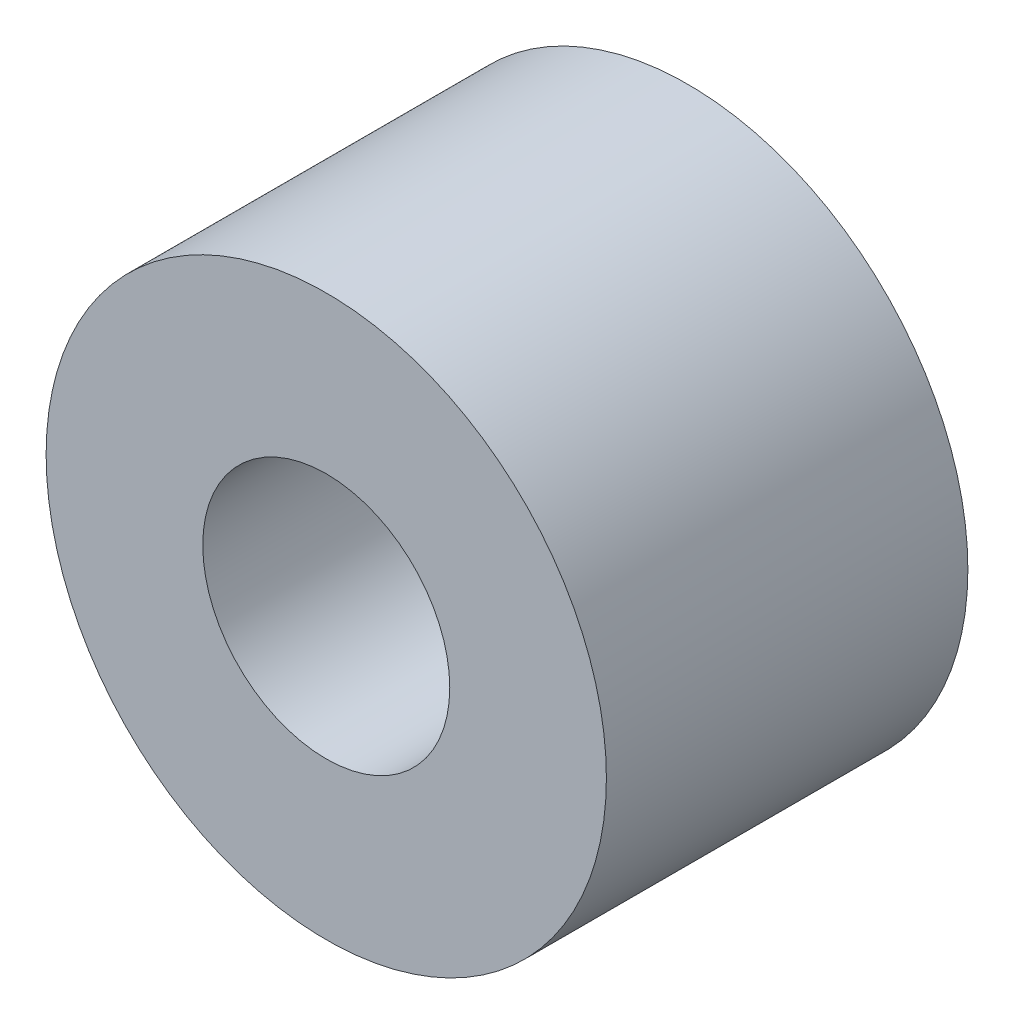
ISO-10303-21;
HEADER;
FILE_DESCRIPTION(('STEP AP214'),'2;1');
FILE_NAME('part.step','',(''),(''),'','','');
FILE_SCHEMA(('AUTOMOTIVE_DESIGN { 1 0 10303 214 1 1 1 1 }'));
ENDSEC;
DATA;
#1=APPLICATION_CONTEXT('core data for automotive mechanical design processes');
#2=APPLICATION_PROTOCOL_DEFINITION('international standard','automotive_design',2000,#1);
#3=PRODUCT_CONTEXT('',#1,'mechanical');
#4=PRODUCT('Part','Part','',(#3));
#5=PRODUCT_RELATED_PRODUCT_CATEGORY('part','',(#4));
#6=PRODUCT_DEFINITION_FORMATION('','',#4);
#7=PRODUCT_DEFINITION_CONTEXT('part definition',#1,'design');
#8=PRODUCT_DEFINITION('design','',#6,#7);
#9=PRODUCT_DEFINITION_SHAPE('','',#8);
#10=(LENGTH_UNIT() NAMED_UNIT(*) SI_UNIT(.MILLI.,.METRE.));
#11=(NAMED_UNIT(*) PLANE_ANGLE_UNIT() SI_UNIT($,.RADIAN.));
#12=(NAMED_UNIT(*) SI_UNIT($,.STERADIAN.) SOLID_ANGLE_UNIT());
#13=UNCERTAINTY_MEASURE_WITH_UNIT(LENGTH_MEASURE(1.E-05),#10,'distance_accuracy_value','');
#14=(GEOMETRIC_REPRESENTATION_CONTEXT(3) GLOBAL_UNCERTAINTY_ASSIGNED_CONTEXT((#13)) GLOBAL_UNIT_ASSIGNED_CONTEXT((#10,
#11,#12)) REPRESENTATION_CONTEXT('',''));
#15=CARTESIAN_POINT('',(0.,0.,0.));
#16=DIRECTION('',(0.,0.,1.));
#17=DIRECTION('',(1.,0.,0.));
#18=AXIS2_PLACEMENT_3D('',#15,#16,#17);
#19=CARTESIAN_POINT('',(0.,0.,18.));
#20=DIRECTION('',(0.,0.,1.));
#21=DIRECTION('',(1.,0.,0.));
#22=AXIS2_PLACEMENT_3D('',#19,#20,#21);
#23=PLANE('',#22);
#24=CARTESIAN_POINT('',(0.,0.,18.));
#25=DIRECTION('',(0.,0.,1.));
#26=DIRECTION('',(1.,0.,0.));
#27=AXIS2_PLACEMENT_3D('',#24,#25,#26);
#28=CIRCLE('',#27,13.95);
#29=CARTESIAN_POINT('',(13.95,0.,18.));
#30=VERTEX_POINT('',#29);
#31=EDGE_CURVE('E10',#30,#30,#28,.T.);
#32=ORIENTED_EDGE('',*,*,#31,.T.);
#33=EDGE_LOOP('',(#32));
#34=FACE_BOUND('',#33,.T.);
#35=CARTESIAN_POINT('',(0.,0.,18.));
#36=DIRECTION('',(0.,0.,1.));
#37=DIRECTION('',(1.,0.,0.));
#38=AXIS2_PLACEMENT_3D('',#35,#36,#37);
#39=CIRCLE('',#38,6.15);
#40=CARTESIAN_POINT('',(6.15,0.,18.));
#41=VERTEX_POINT('',#40);
#42=EDGE_CURVE('E42',#41,#41,#39,.T.);
#43=ORIENTED_EDGE('',*,*,#42,.F.);
#44=EDGE_LOOP('',(#43));
#45=FACE_BOUND('',#44,.T.);
#46=ADVANCED_FACE('F31',(#34,#45),#23,.T.);
#47=CARTESIAN_POINT('',(0.,0.,0.));
#48=DIRECTION('',(0.,0.,1.));
#49=DIRECTION('',(1.,0.,0.));
#50=AXIS2_PLACEMENT_3D('',#47,#48,#49);
#51=PLANE('',#50);
#52=CARTESIAN_POINT('',(0.,0.,0.));
#53=DIRECTION('',(0.,0.,1.));
#54=DIRECTION('',(1.,0.,0.));
#55=AXIS2_PLACEMENT_3D('',#52,#53,#54);
#56=CIRCLE('',#55,13.95);
#57=CARTESIAN_POINT('',(13.95,0.,0.));
#58=VERTEX_POINT('',#57);
#59=EDGE_CURVE('E35',#58,#58,#56,.T.);
#60=ORIENTED_EDGE('',*,*,#59,.F.);
#61=EDGE_LOOP('',(#60));
#62=FACE_BOUND('',#61,.T.);
#63=CARTESIAN_POINT('',(0.,0.,0.));
#64=DIRECTION('',(0.,0.,1.));
#65=DIRECTION('',(1.,0.,0.));
#66=AXIS2_PLACEMENT_3D('',#63,#64,#65);
#67=CIRCLE('',#66,6.15);
#68=CARTESIAN_POINT('',(6.15,0.,0.));
#69=VERTEX_POINT('',#68);
#70=EDGE_CURVE('E44',#69,#69,#67,.T.);
#71=ORIENTED_EDGE('',*,*,#70,.T.);
#72=EDGE_LOOP('',(#71));
#73=FACE_BOUND('',#72,.T.);
#74=ADVANCED_FACE('F54',(#62,#73),#51,.F.);
#75=CARTESIAN_POINT('',(0.,0.,18.));
#76=DIRECTION('',(0.,0.,-1.));
#77=DIRECTION('',(-1.,0.,0.));
#78=AXIS2_PLACEMENT_3D('',#75,#76,#77);
#79=CYLINDRICAL_SURFACE('',#78,13.95);
#80=ORIENTED_EDGE('',*,*,#31,.F.);
#81=EDGE_LOOP('',(#80));
#82=FACE_BOUND('',#81,.T.);
#83=ORIENTED_EDGE('',*,*,#59,.T.);
#84=EDGE_LOOP('',(#83));
#85=FACE_BOUND('',#84,.T.);
#86=ADVANCED_FACE('F33',(#82,#85),#79,.T.);
#87=CARTESIAN_POINT('',(0.,0.,18.));
#88=DIRECTION('',(0.,0.,-1.));
#89=DIRECTION('',(-1.,0.,0.));
#90=AXIS2_PLACEMENT_3D('',#87,#88,#89);
#91=CYLINDRICAL_SURFACE('',#90,6.15);
#92=ORIENTED_EDGE('',*,*,#42,.T.);
#93=EDGE_LOOP('',(#92));
#94=FACE_BOUND('',#93,.T.);
#95=ORIENTED_EDGE('',*,*,#70,.F.);
#96=EDGE_LOOP('',(#95));
#97=FACE_BOUND('',#96,.T.);
#98=ADVANCED_FACE('F50',(#94,#97),#91,.F.);
#99=CLOSED_SHELL('',(#46,#74,#86,#98));
#100=MANIFOLD_SOLID_BREP('B2',#99);
#101=ADVANCED_BREP_SHAPE_REPRESENTATION('',(#18,#100),#14);
#102=SHAPE_DEFINITION_REPRESENTATION(#9,#101);
ENDSEC;
END-ISO-10303-21;
